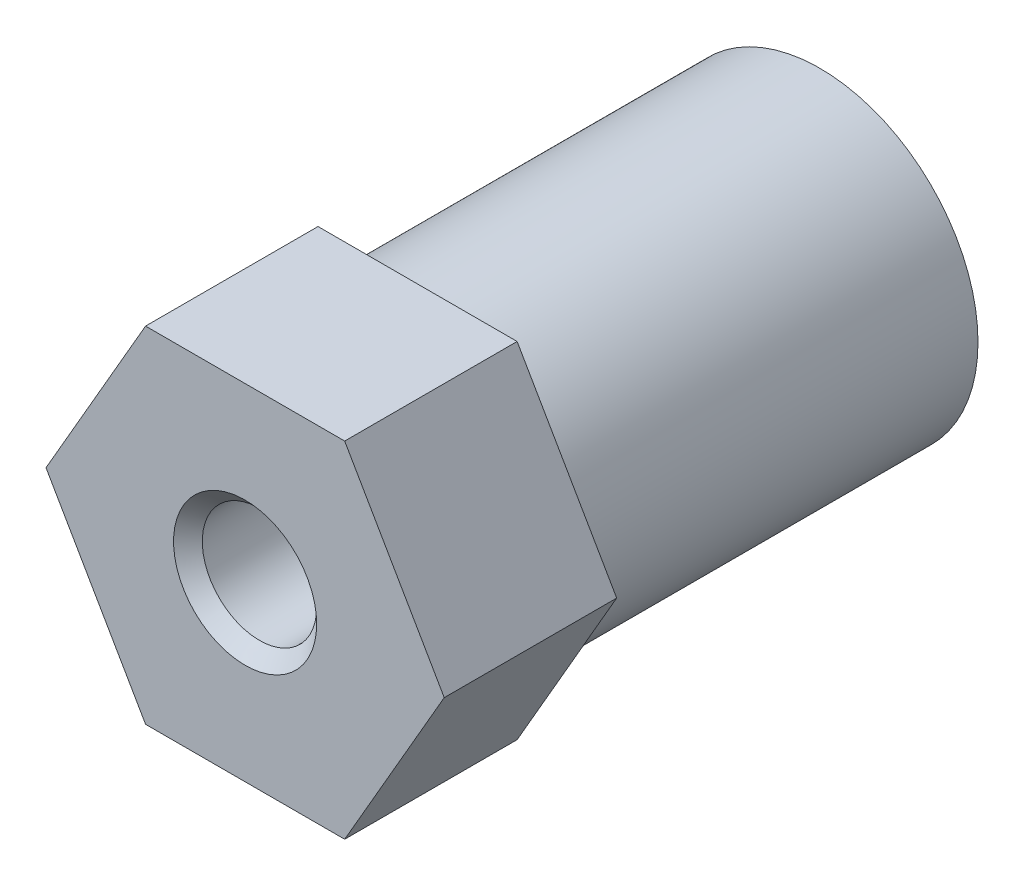
ISO-10303-21;
HEADER;
FILE_DESCRIPTION(('STEP AP214'),'2;1');
FILE_NAME('part.step','',(''),(''),'','','');
FILE_SCHEMA(('AUTOMOTIVE_DESIGN { 1 0 10303 214 1 1 1 1 }'));
ENDSEC;
DATA;
#1=APPLICATION_CONTEXT('core data for automotive mechanical design processes');
#2=APPLICATION_PROTOCOL_DEFINITION('international standard','automotive_design',2000,#1);
#3=PRODUCT_CONTEXT('',#1,'mechanical');
#4=PRODUCT('Part','Part','',(#3));
#5=PRODUCT_RELATED_PRODUCT_CATEGORY('part','',(#4));
#6=PRODUCT_DEFINITION_FORMATION('','',#4);
#7=PRODUCT_DEFINITION_CONTEXT('part definition',#1,'design');
#8=PRODUCT_DEFINITION('design','',#6,#7);
#9=PRODUCT_DEFINITION_SHAPE('','',#8);
#10=(LENGTH_UNIT() NAMED_UNIT(*) SI_UNIT(.MILLI.,.METRE.));
#11=(NAMED_UNIT(*) PLANE_ANGLE_UNIT() SI_UNIT($,.RADIAN.));
#12=(NAMED_UNIT(*) SI_UNIT($,.STERADIAN.) SOLID_ANGLE_UNIT());
#13=UNCERTAINTY_MEASURE_WITH_UNIT(LENGTH_MEASURE(1.E-05),#10,'distance_accuracy_value','');
#14=(GEOMETRIC_REPRESENTATION_CONTEXT(3) GLOBAL_UNCERTAINTY_ASSIGNED_CONTEXT((#13)) GLOBAL_UNIT_ASSIGNED_CONTEXT((#10,
#11,#12)) REPRESENTATION_CONTEXT('',''));
#15=CARTESIAN_POINT('',(0.,0.,0.));
#16=DIRECTION('',(0.,0.,1.));
#17=DIRECTION('',(1.,0.,0.));
#18=AXIS2_PLACEMENT_3D('',#15,#16,#17);
#19=CARTESIAN_POINT('',(2.23606797749979,2.,12.));
#20=DIRECTION('',(0.,1.,0.));
#21=DIRECTION('',(0.,0.,1.));
#22=AXIS2_PLACEMENT_3D('',#19,#20,#21);
#23=PLANE('',#22);
#24=DIRECTION('',(0.,0.,-1.));
#25=VECTOR('',#24,1.);
#26=CARTESIAN_POINT('',(-2.23606797749979,2.,12.));
#27=LINE('',#26,#25);
#28=CARTESIAN_POINT('',(-2.23606797749979,2.,12.));
#29=VERTEX_POINT('',#28);
#30=CARTESIAN_POINT('',(-2.23606797749979,2.,2.));
#31=VERTEX_POINT('',#30);
#32=EDGE_CURVE('E178',#29,#31,#27,.T.);
#33=ORIENTED_EDGE('',*,*,#32,.T.);
#34=DIRECTION('',(-1.,0.,0.));
#35=VECTOR('',#34,1.);
#36=CARTESIAN_POINT('',(2.23606797749979,2.,2.));
#37=LINE('',#36,#35);
#38=CARTESIAN_POINT('',(2.23606797749979,2.,2.));
#39=VERTEX_POINT('',#38);
#40=EDGE_CURVE('E260',#31,#39,#37,.F.);
#41=ORIENTED_EDGE('',*,*,#40,.T.);
#42=DIRECTION('',(0.,0.,-1.));
#43=VECTOR('',#42,1.);
#44=CARTESIAN_POINT('',(2.23606797749979,2.,12.));
#45=LINE('',#44,#43);
#46=CARTESIAN_POINT('',(2.23606797749979,2.,12.));
#47=VERTEX_POINT('',#46);
#48=EDGE_CURVE('E174',#47,#39,#45,.T.);
#49=ORIENTED_EDGE('',*,*,#48,.F.);
#50=DIRECTION('',(1.,0.,0.));
#51=VECTOR('',#50,1.);
#52=CARTESIAN_POINT('',(2.23606797749979,2.,12.));
#53=LINE('',#52,#51);
#54=EDGE_CURVE('E143',#29,#47,#53,.T.);
#55=ORIENTED_EDGE('',*,*,#54,.F.);
#56=EDGE_LOOP('',(#33,#41,#49,#55));
#57=FACE_BOUND('',#56,.T.);
#58=ADVANCED_FACE('F45',(#57),#23,.F.);
#59=CARTESIAN_POINT('',(2.23606797749979,-2.,12.));
#60=DIRECTION('',(0.,-1.,0.));
#61=DIRECTION('',(0.,0.,-1.));
#62=AXIS2_PLACEMENT_3D('',#59,#60,#61);
#63=PLANE('',#62);
#64=DIRECTION('',(0.,0.,-1.));
#65=VECTOR('',#64,1.);
#66=CARTESIAN_POINT('',(2.23606797749979,-2.,12.));
#67=LINE('',#66,#65);
#68=CARTESIAN_POINT('',(2.23606797749979,-2.,12.));
#69=VERTEX_POINT('',#68);
#70=CARTESIAN_POINT('',(2.23606797749979,-2.,2.));
#71=VERTEX_POINT('',#70);
#72=EDGE_CURVE('E134',#69,#71,#67,.T.);
#73=ORIENTED_EDGE('',*,*,#72,.T.);
#74=DIRECTION('',(1.,0.,0.));
#75=VECTOR('',#74,1.);
#76=CARTESIAN_POINT('',(-2.23606797749979,-2.,2.));
#77=LINE('',#76,#75);
#78=CARTESIAN_POINT('',(-2.23606797749979,-2.,2.));
#79=VERTEX_POINT('',#78);
#80=EDGE_CURVE('E69',#71,#79,#77,.F.);
#81=ORIENTED_EDGE('',*,*,#80,.T.);
#82=DIRECTION('',(0.,0.,-1.));
#83=VECTOR('',#82,1.);
#84=CARTESIAN_POINT('',(-2.23606797749979,-2.,12.));
#85=LINE('',#84,#83);
#86=CARTESIAN_POINT('',(-2.23606797749979,-2.,12.));
#87=VERTEX_POINT('',#86);
#88=EDGE_CURVE('E142',#87,#79,#85,.T.);
#89=ORIENTED_EDGE('',*,*,#88,.F.);
#90=DIRECTION('',(-1.,0.,0.));
#91=VECTOR('',#90,1.);
#92=CARTESIAN_POINT('',(2.23606797749979,-2.,12.));
#93=LINE('',#92,#91);
#94=EDGE_CURVE('E146',#69,#87,#93,.T.);
#95=ORIENTED_EDGE('',*,*,#94,.F.);
#96=EDGE_LOOP('',(#73,#81,#89,#95));
#97=FACE_BOUND('',#96,.T.);
#98=ADVANCED_FACE('F147',(#97),#63,.F.);
#99=CARTESIAN_POINT('',(0.,0.,14.));
#100=DIRECTION('',(0.,0.,-1.));
#101=DIRECTION('',(-1.,0.,0.));
#102=AXIS2_PLACEMENT_3D('',#99,#100,#101);
#103=CYLINDRICAL_SURFACE('',#102,5.5);
#104=CARTESIAN_POINT('',(0.,0.,14.));
#105=DIRECTION('',(0.,0.,1.));
#106=DIRECTION('',(1.,0.,0.));
#107=AXIS2_PLACEMENT_3D('',#104,#105,#106);
#108=CIRCLE('',#107,5.5);
#109=CARTESIAN_POINT('',(5.5,0.,14.));
#110=VERTEX_POINT('',#109);
#111=EDGE_CURVE('E249',#110,#110,#108,.T.);
#112=ORIENTED_EDGE('',*,*,#111,.F.);
#113=EDGE_LOOP('',(#112));
#114=FACE_BOUND('',#113,.T.);
#115=CARTESIAN_POINT('',(0.,0.,0.));
#116=DIRECTION('',(0.,0.,1.));
#117=DIRECTION('',(1.,0.,0.));
#118=AXIS2_PLACEMENT_3D('',#115,#116,#117);
#119=CIRCLE('',#118,5.5);
#120=CARTESIAN_POINT('',(5.5,0.,0.));
#121=VERTEX_POINT('',#120);
#122=EDGE_CURVE('E248',#121,#121,#119,.T.);
#123=ORIENTED_EDGE('',*,*,#122,.T.);
#124=EDGE_LOOP('',(#123));
#125=FACE_BOUND('',#124,.T.);
#126=ADVANCED_FACE('F293',(#114,#125),#103,.T.);
#127=CARTESIAN_POINT('',(0.,0.,0.));
#128=DIRECTION('',(0.,0.,1.));
#129=DIRECTION('',(1.,0.,0.));
#130=AXIS2_PLACEMENT_3D('',#127,#128,#129);
#131=PLANE('',#130);
#132=CARTESIAN_POINT('',(0.,0.,0.));
#133=DIRECTION('',(0.,0.,-1.));
#134=DIRECTION('',(-1.,0.,0.));
#135=AXIS2_PLACEMENT_3D('',#132,#133,#134);
#136=CIRCLE('',#135,3.);
#137=CARTESIAN_POINT('',(-3.,0.,0.));
#138=VERTEX_POINT('',#137);
#139=EDGE_CURVE('E158',#138,#138,#136,.T.);
#140=ORIENTED_EDGE('',*,*,#139,.F.);
#141=EDGE_LOOP('',(#140));
#142=FACE_BOUND('',#141,.T.);
#143=ORIENTED_EDGE('',*,*,#122,.F.);
#144=EDGE_LOOP('',(#143));
#145=FACE_BOUND('',#144,.T.);
#146=ADVANCED_FACE('F400',(#142,#145),#131,.F.);
#147=CARTESIAN_POINT('',(-3.46410161513776,6.,20.));
#148=DIRECTION('',(0.866025403784439,-0.5,0.));
#149=DIRECTION('',(0.5,0.866025403784439,0.));
#150=AXIS2_PLACEMENT_3D('',#147,#148,#149);
#151=PLANE('',#150);
#152=DIRECTION('',(-0.5,-0.866025403784438,0.));
#153=VECTOR('',#152,1.);
#154=CARTESIAN_POINT('',(-3.46410161513776,6.,14.));
#155=LINE('',#154,#153);
#156=CARTESIAN_POINT('',(-3.46410161513776,6.,14.));
#157=VERTEX_POINT('',#156);
#158=CARTESIAN_POINT('',(-6.92820323027551,0.,14.));
#159=VERTEX_POINT('',#158);
#160=EDGE_CURVE('E187',#157,#159,#155,.T.);
#161=ORIENTED_EDGE('',*,*,#160,.T.);
#162=DIRECTION('',(0.,0.,-1.));
#163=VECTOR('',#162,1.);
#164=CARTESIAN_POINT('',(-6.92820323027551,0.,20.));
#165=LINE('',#164,#163);
#166=CARTESIAN_POINT('',(-6.92820323027551,0.,20.));
#167=VERTEX_POINT('',#166);
#168=EDGE_CURVE('E244',#167,#159,#165,.T.);
#169=ORIENTED_EDGE('',*,*,#168,.F.);
#170=DIRECTION('',(-0.5,-0.866025403784438,0.));
#171=VECTOR('',#170,1.);
#172=CARTESIAN_POINT('',(-3.46410161513776,6.,20.));
#173=LINE('',#172,#171);
#174=CARTESIAN_POINT('',(-3.46410161513776,6.,20.));
#175=VERTEX_POINT('',#174);
#176=EDGE_CURVE('E188',#175,#167,#173,.T.);
#177=ORIENTED_EDGE('',*,*,#176,.F.);
#178=DIRECTION('',(0.,0.,-1.));
#179=VECTOR('',#178,1.);
#180=CARTESIAN_POINT('',(-3.46410161513776,6.,20.));
#181=LINE('',#180,#179);
#182=EDGE_CURVE('E207',#175,#157,#181,.T.);
#183=ORIENTED_EDGE('',*,*,#182,.T.);
#184=EDGE_LOOP('',(#161,#169,#177,#183));
#185=FACE_BOUND('',#184,.T.);
#186=ADVANCED_FACE('F403',(#185),#151,.F.);
#187=CARTESIAN_POINT('',(-6.92820323027551,0.,20.));
#188=DIRECTION('',(0.866025403784439,0.5,0.));
#189=DIRECTION('',(-0.5,0.866025403784439,0.));
#190=AXIS2_PLACEMENT_3D('',#187,#188,#189);
#191=PLANE('',#190);
#192=DIRECTION('',(0.5,-0.866025403784439,0.));
#193=VECTOR('',#192,1.);
#194=CARTESIAN_POINT('',(-6.92820323027551,0.,14.));
#195=LINE('',#194,#193);
#196=CARTESIAN_POINT('',(-3.46410161513776,-6.,14.));
#197=VERTEX_POINT('',#196);
#198=EDGE_CURVE('E211',#159,#197,#195,.T.);
#199=ORIENTED_EDGE('',*,*,#198,.T.);
#200=DIRECTION('',(0.,0.,-1.));
#201=VECTOR('',#200,1.);
#202=CARTESIAN_POINT('',(-3.46410161513776,-6.,20.));
#203=LINE('',#202,#201);
#204=CARTESIAN_POINT('',(-3.46410161513776,-6.,20.));
#205=VERTEX_POINT('',#204);
#206=EDGE_CURVE('E240',#205,#197,#203,.T.);
#207=ORIENTED_EDGE('',*,*,#206,.F.);
#208=DIRECTION('',(0.5,-0.866025403784439,0.));
#209=VECTOR('',#208,1.);
#210=CARTESIAN_POINT('',(-6.92820323027551,0.,20.));
#211=LINE('',#210,#209);
#212=EDGE_CURVE('E192',#167,#205,#211,.T.);
#213=ORIENTED_EDGE('',*,*,#212,.F.);
#214=ORIENTED_EDGE('',*,*,#168,.T.);
#215=EDGE_LOOP('',(#199,#207,#213,#214));
#216=FACE_BOUND('',#215,.T.);
#217=ADVANCED_FACE('F443',(#216),#191,.F.);
#218=CARTESIAN_POINT('',(-3.46410161513776,-6.,20.));
#219=DIRECTION('',(0.,1.,0.));
#220=DIRECTION('',(-1.,0.,0.));
#221=AXIS2_PLACEMENT_3D('',#218,#219,#220);
#222=PLANE('',#221);
#223=DIRECTION('',(1.,0.,0.));
#224=VECTOR('',#223,1.);
#225=CARTESIAN_POINT('',(-3.46410161513776,-6.,14.));
#226=LINE('',#225,#224);
#227=CARTESIAN_POINT('',(3.46410161513775,-6.,14.));
#228=VERTEX_POINT('',#227);
#229=EDGE_CURVE('E214',#197,#228,#226,.T.);
#230=ORIENTED_EDGE('',*,*,#229,.T.);
#231=DIRECTION('',(0.,0.,-1.));
#232=VECTOR('',#231,1.);
#233=CARTESIAN_POINT('',(3.46410161513775,-6.,20.));
#234=LINE('',#233,#232);
#235=CARTESIAN_POINT('',(3.46410161513775,-6.,20.));
#236=VERTEX_POINT('',#235);
#237=EDGE_CURVE('E236',#236,#228,#234,.T.);
#238=ORIENTED_EDGE('',*,*,#237,.F.);
#239=DIRECTION('',(1.,0.,0.));
#240=VECTOR('',#239,1.);
#241=CARTESIAN_POINT('',(-3.46410161513776,-6.,20.));
#242=LINE('',#241,#240);
#243=EDGE_CURVE('E195',#205,#236,#242,.T.);
#244=ORIENTED_EDGE('',*,*,#243,.F.);
#245=ORIENTED_EDGE('',*,*,#206,.T.);
#246=EDGE_LOOP('',(#230,#238,#244,#245));
#247=FACE_BOUND('',#246,.T.);
#248=ADVANCED_FACE('F440',(#247),#222,.F.);
#249=CARTESIAN_POINT('',(3.46410161513775,-6.,20.));
#250=DIRECTION('',(-0.866025403784439,0.5,0.));
#251=DIRECTION('',(-0.5,-0.866025403784439,0.));
#252=AXIS2_PLACEMENT_3D('',#249,#250,#251);
#253=PLANE('',#252);
#254=DIRECTION('',(0.5,0.866025403784439,0.));
#255=VECTOR('',#254,1.);
#256=CARTESIAN_POINT('',(3.46410161513775,-6.,14.));
#257=LINE('',#256,#255);
#258=CARTESIAN_POINT('',(6.92820323027551,0.,14.));
#259=VERTEX_POINT('',#258);
#260=EDGE_CURVE('E217',#228,#259,#257,.T.);
#261=ORIENTED_EDGE('',*,*,#260,.T.);
#262=DIRECTION('',(0.,0.,-1.));
#263=VECTOR('',#262,1.);
#264=CARTESIAN_POINT('',(6.92820323027551,0.,20.));
#265=LINE('',#264,#263);
#266=CARTESIAN_POINT('',(6.92820323027551,0.,20.));
#267=VERTEX_POINT('',#266);
#268=EDGE_CURVE('E232',#267,#259,#265,.T.);
#269=ORIENTED_EDGE('',*,*,#268,.F.);
#270=DIRECTION('',(0.5,0.866025403784439,0.));
#271=VECTOR('',#270,1.);
#272=CARTESIAN_POINT('',(3.46410161513775,-6.,20.));
#273=LINE('',#272,#271);
#274=EDGE_CURVE('E198',#236,#267,#273,.T.);
#275=ORIENTED_EDGE('',*,*,#274,.F.);
#276=ORIENTED_EDGE('',*,*,#237,.T.);
#277=EDGE_LOOP('',(#261,#269,#275,#276));
#278=FACE_BOUND('',#277,.T.);
#279=ADVANCED_FACE('F435',(#278),#253,.F.);
#280=CARTESIAN_POINT('',(6.92820323027551,0.,20.));
#281=DIRECTION('',(-0.866025403784439,-0.5,0.));
#282=DIRECTION('',(0.5,-0.866025403784439,0.));
#283=AXIS2_PLACEMENT_3D('',#280,#281,#282);
#284=PLANE('',#283);
#285=DIRECTION('',(-0.5,0.866025403784439,0.));
#286=VECTOR('',#285,1.);
#287=CARTESIAN_POINT('',(6.92820323027551,0.,14.));
#288=LINE('',#287,#286);
#289=CARTESIAN_POINT('',(3.46410161513776,6.,14.));
#290=VERTEX_POINT('',#289);
#291=EDGE_CURVE('E220',#259,#290,#288,.T.);
#292=ORIENTED_EDGE('',*,*,#291,.T.);
#293=DIRECTION('',(0.,0.,-1.));
#294=VECTOR('',#293,1.);
#295=CARTESIAN_POINT('',(3.46410161513776,6.,20.));
#296=LINE('',#295,#294);
#297=CARTESIAN_POINT('',(3.46410161513776,6.,20.));
#298=VERTEX_POINT('',#297);
#299=EDGE_CURVE('E228',#298,#290,#296,.T.);
#300=ORIENTED_EDGE('',*,*,#299,.F.);
#301=DIRECTION('',(-0.5,0.866025403784439,0.));
#302=VECTOR('',#301,1.);
#303=CARTESIAN_POINT('',(6.92820323027551,0.,20.));
#304=LINE('',#303,#302);
#305=EDGE_CURVE('E201',#267,#298,#304,.T.);
#306=ORIENTED_EDGE('',*,*,#305,.F.);
#307=ORIENTED_EDGE('',*,*,#268,.T.);
#308=EDGE_LOOP('',(#292,#300,#306,#307));
#309=FACE_BOUND('',#308,.T.);
#310=ADVANCED_FACE('F431',(#309),#284,.F.);
#311=CARTESIAN_POINT('',(3.46410161513776,6.,20.));
#312=DIRECTION('',(0.,-1.,0.));
#313=DIRECTION('',(0.,0.,-1.));
#314=AXIS2_PLACEMENT_3D('',#311,#312,#313);
#315=PLANE('',#314);
#316=DIRECTION('',(-1.,0.,0.));
#317=VECTOR('',#316,1.);
#318=CARTESIAN_POINT('',(3.46410161513776,6.,14.));
#319=LINE('',#318,#317);
#320=EDGE_CURVE('E193',#290,#157,#319,.T.);
#321=ORIENTED_EDGE('',*,*,#320,.T.);
#322=ORIENTED_EDGE('',*,*,#182,.F.);
#323=DIRECTION('',(-1.,0.,0.));
#324=VECTOR('',#323,1.);
#325=CARTESIAN_POINT('',(3.46410161513776,6.,20.));
#326=LINE('',#325,#324);
#327=EDGE_CURVE('E204',#298,#175,#326,.T.);
#328=ORIENTED_EDGE('',*,*,#327,.F.);
#329=ORIENTED_EDGE('',*,*,#299,.T.);
#330=EDGE_LOOP('',(#321,#322,#328,#329));
#331=FACE_BOUND('',#330,.T.);
#332=ADVANCED_FACE('F427',(#331),#315,.F.);
#333=CARTESIAN_POINT('',(0.,0.,20.));
#334=DIRECTION('',(0.,0.,1.));
#335=DIRECTION('',(1.,0.,0.));
#336=AXIS2_PLACEMENT_3D('',#333,#334,#335);
#337=PLANE('',#336);
#338=CARTESIAN_POINT('',(0.,0.,20.));
#339=DIRECTION('',(0.,0.,1.));
#340=DIRECTION('',(1.,0.,0.));
#341=AXIS2_PLACEMENT_3D('',#338,#339,#340);
#342=CIRCLE('',#341,2.49000000000001);
#343=CARTESIAN_POINT('',(2.49000000000001,0.,20.));
#344=VERTEX_POINT('',#343);
#345=EDGE_CURVE('E11',#344,#344,#342,.F.);
#346=ORIENTED_EDGE('',*,*,#345,.T.);
#347=EDGE_LOOP('',(#346));
#348=FACE_BOUND('',#347,.T.);
#349=ORIENTED_EDGE('',*,*,#176,.T.);
#350=ORIENTED_EDGE('',*,*,#212,.T.);
#351=ORIENTED_EDGE('',*,*,#243,.T.);
#352=ORIENTED_EDGE('',*,*,#274,.T.);
#353=ORIENTED_EDGE('',*,*,#305,.T.);
#354=ORIENTED_EDGE('',*,*,#327,.T.);
#355=EDGE_LOOP('',(#349,#350,#351,#352,#353,#354));
#356=FACE_BOUND('',#355,.T.);
#357=ADVANCED_FACE('F415',(#348,#356),#337,.T.);
#358=CARTESIAN_POINT('',(0.,0.,14.));
#359=DIRECTION('',(0.,0.,1.));
#360=DIRECTION('',(1.,0.,0.));
#361=AXIS2_PLACEMENT_3D('',#358,#359,#360);
#362=PLANE('',#361);
#363=ORIENTED_EDGE('',*,*,#111,.T.);
#364=EDGE_LOOP('',(#363));
#365=FACE_BOUND('',#364,.T.);
#366=ORIENTED_EDGE('',*,*,#160,.F.);
#367=ORIENTED_EDGE('',*,*,#320,.F.);
#368=ORIENTED_EDGE('',*,*,#291,.F.);
#369=ORIENTED_EDGE('',*,*,#260,.F.);
#370=ORIENTED_EDGE('',*,*,#229,.F.);
#371=ORIENTED_EDGE('',*,*,#198,.F.);
#372=EDGE_LOOP('',(#366,#367,#368,#369,#370,#371));
#373=FACE_BOUND('',#372,.T.);
#374=ADVANCED_FACE('F412',(#365,#373),#362,.F.);
#375=CARTESIAN_POINT('',(0.,0.,12.));
#376=DIRECTION('',(0.,0.,1.));
#377=DIRECTION('',(1.,0.,0.));
#378=AXIS2_PLACEMENT_3D('',#375,#376,#377);
#379=CYLINDRICAL_SURFACE('',#378,1.99);
#380=CARTESIAN_POINT('',(0.,0.,19.5));
#381=DIRECTION('',(0.,0.,1.));
#382=DIRECTION('',(1.,0.,0.));
#383=AXIS2_PLACEMENT_3D('',#380,#381,#382);
#384=CIRCLE('',#383,1.99);
#385=CARTESIAN_POINT('',(1.99,0.,19.5));
#386=VERTEX_POINT('',#385);
#387=EDGE_CURVE('E55',#386,#386,#384,.T.);
#388=ORIENTED_EDGE('',*,*,#387,.T.);
#389=EDGE_LOOP('',(#388));
#390=FACE_BOUND('',#389,.T.);
#391=CARTESIAN_POINT('',(0.,0.,12.));
#392=DIRECTION('',(0.,0.,1.));
#393=DIRECTION('',(1.,0.,0.));
#394=AXIS2_PLACEMENT_3D('',#391,#392,#393);
#395=CIRCLE('',#394,1.99);
#396=CARTESIAN_POINT('',(1.99,0.,12.));
#397=VERTEX_POINT('',#396);
#398=EDGE_CURVE('E177',#397,#397,#395,.T.);
#399=ORIENTED_EDGE('',*,*,#398,.F.);
#400=EDGE_LOOP('',(#399));
#401=FACE_BOUND('',#400,.T.);
#402=ADVANCED_FACE('F316',(#390,#401),#379,.F.);
#403=CARTESIAN_POINT('',(0.,0.,12.));
#404=DIRECTION('',(0.,0.,-1.));
#405=DIRECTION('',(-1.,0.,0.));
#406=AXIS2_PLACEMENT_3D('',#403,#404,#405);
#407=PLANE('',#406);
#408=CARTESIAN_POINT('',(0.,0.,12.));
#409=DIRECTION('',(0.,0.,-1.));
#410=DIRECTION('',(-1.,0.,0.));
#411=AXIS2_PLACEMENT_3D('',#408,#409,#410);
#412=CIRCLE('',#411,3.);
#413=EDGE_CURVE('E139',#47,#69,#412,.T.);
#414=ORIENTED_EDGE('',*,*,#413,.T.);
#415=ORIENTED_EDGE('',*,*,#94,.T.);
#416=CARTESIAN_POINT('',(0.,0.,12.));
#417=DIRECTION('',(0.,0.,-1.));
#418=DIRECTION('',(-1.,0.,0.));
#419=AXIS2_PLACEMENT_3D('',#416,#417,#418);
#420=CIRCLE('',#419,3.);
#421=EDGE_CURVE('E152',#87,#29,#420,.T.);
#422=ORIENTED_EDGE('',*,*,#421,.T.);
#423=ORIENTED_EDGE('',*,*,#54,.T.);
#424=EDGE_LOOP('',(#414,#415,#422,#423));
#425=FACE_BOUND('',#424,.T.);
#426=ORIENTED_EDGE('',*,*,#398,.T.);
#427=EDGE_LOOP('',(#426));
#428=FACE_BOUND('',#427,.T.);
#429=ADVANCED_FACE('F154',(#425,#428),#407,.T.);
#430=CARTESIAN_POINT('',(0.,0.,12.));
#431=DIRECTION('',(0.,0.,-1.));
#432=DIRECTION('',(-1.,0.,0.));
#433=AXIS2_PLACEMENT_3D('',#430,#431,#432);
#434=CYLINDRICAL_SURFACE('',#433,3.);
#435=ORIENTED_EDGE('',*,*,#139,.T.);
#436=EDGE_LOOP('',(#435));
#437=FACE_BOUND('',#436,.T.);
#438=CARTESIAN_POINT('',(0.,0.,1.5));
#439=DIRECTION('',(0.,0.,-1.));
#440=DIRECTION('',(-1.,0.,0.));
#441=AXIS2_PLACEMENT_3D('',#438,#439,#440);
#442=CIRCLE('',#441,3.);
#443=CARTESIAN_POINT('',(1.6583123951777,-2.5,1.5));
#444=VERTEX_POINT('',#443);
#445=CARTESIAN_POINT('',(-1.6583123951777,-2.5,1.5));
#446=VERTEX_POINT('',#445);
#447=EDGE_CURVE('E168',#444,#446,#442,.T.);
#448=ORIENTED_EDGE('',*,*,#447,.F.);
#449=CARTESIAN_POINT('',(1.6583123951777,-2.5,1.5));
#450=CARTESIAN_POINT('',(1.686685574335,-2.48118634349568,1.50001114225031));
#451=CARTESIAN_POINT('',(1.71475813919343,-2.46186288459904,1.50106399634946));
#452=CARTESIAN_POINT('',(1.77023433936187,-2.42227750666596,1.50567038120268));
#453=CARTESIAN_POINT('',(1.79763382207024,-2.40201129563713,1.50923666640761));
#454=CARTESIAN_POINT('',(1.85182298451462,-2.36049490812776,1.51937423619315));
#455=CARTESIAN_POINT('',(1.87859638498599,-2.33923429026674,1.52599172502152));
#456=CARTESIAN_POINT('',(1.93069378652664,-2.2964219098173,1.54274375912904));
#457=CARTESIAN_POINT('',(1.95602106713984,-2.27487095513514,1.55286994562929));
#458=CARTESIAN_POINT('',(2.00352854772826,-2.23311861033452,1.57653972837565));
#459=CARTESIAN_POINT('',(2.02580484491539,-2.21290720822436,1.58986915550978));
#460=CARTESIAN_POINT('',(2.06812583467583,-2.17340464034994,1.62058231984035));
#461=CARTESIAN_POINT('',(2.08817971718188,-2.15410988911167,1.6379483649406));
#462=CARTESIAN_POINT('',(2.12266633931463,-2.12009066789494,1.67413334326885));
#463=CARTESIAN_POINT('',(2.13749072844714,-2.10511571802555,1.69233856864437));
#464=CARTESIAN_POINT('',(2.16461187452528,-2.07721774487165,1.73196929500812));
#465=CARTESIAN_POINT('',(2.17690968080016,-2.06429387025311,1.75339345269704));
#466=CARTESIAN_POINT('',(2.19651150127353,-2.04340551098062,1.7951425423394));
#467=CARTESIAN_POINT('',(2.20431358759365,-2.03496844110853,1.81499631608498));
#468=CARTESIAN_POINT('',(2.21750266020016,-2.02058837265816,1.85632896163363));
#469=CARTESIAN_POINT('',(2.22289367051298,-2.01464121953807,1.87780505525366));
#470=CARTESIAN_POINT('',(2.22996266063237,-2.00681030083135,1.91609520614005));
#471=CARTESIAN_POINT('',(2.23224180835755,-2.00427185549075,1.93266808755406));
#472=CARTESIAN_POINT('',(2.23529908912286,-2.00085964205873,1.96615545512857));
#473=CARTESIAN_POINT('',(2.23607401870716,-1.99998942675956,1.98307059299181));
#474=CARTESIAN_POINT('',(2.23606797749979,-2.,2.));
#475=B_SPLINE_CURVE_WITH_KNOTS('',3,(#449,#450,#451,#452,#453,#454,#455,#456,#457,#458,#459,
#460,#461,#462,#463,#464,#465,#466,#467,#468,#469,#470,#471,#472,#473,#474),.UNSPECIFIED.,.F.,
.F.,(4,2,2,2,2,2,2,2,2,2,2,2,4),(0.,0.102158391319055,0.204838955018789,0.309128225213242,
0.41317073585731,0.511592620984886,0.609591006305015,0.692815668784243,0.77600569657881,
0.844541537354591,0.912962562707333,0.963578132947559,1.01430137880361),.UNSPECIFIED.);
#476=EDGE_CURVE('E62',#444,#71,#475,.T.);
#477=ORIENTED_EDGE('',*,*,#476,.T.);
#478=ORIENTED_EDGE('',*,*,#72,.F.);
#479=ORIENTED_EDGE('',*,*,#413,.F.);
#480=ORIENTED_EDGE('',*,*,#48,.T.);
#481=CARTESIAN_POINT('',(2.23606797749979,2.,2.));
#482=CARTESIAN_POINT('',(2.23609051463813,1.99996314456617,1.97728819850553));
#483=CARTESIAN_POINT('',(2.23468615647214,2.00154505931008,1.95461357147146));
#484=CARTESIAN_POINT('',(2.22921431389916,2.00764344179947,1.91013583118931));
#485=CARTESIAN_POINT('',(2.22516389345562,2.01214110501253,1.88832807715498));
#486=CARTESIAN_POINT('',(2.21459459832048,2.0237658003137,1.84610743758677));
#487=CARTESIAN_POINT('',(2.20807957493583,2.03088872959056,1.82569243412387));
#488=CARTESIAN_POINT('',(2.19285313096424,2.04732060076244,1.7866195943571));
#489=CARTESIAN_POINT('',(2.18413826158172,2.05663297355749,1.76796458094776));
#490=CARTESIAN_POINT('',(2.16186587002878,2.0800643693,1.72731088059639));
#491=CARTESIAN_POINT('',(2.14764179063573,2.09478359832793,1.70602349545034));
#492=CARTESIAN_POINT('',(2.11662069282733,2.12612453590936,1.66706672692429));
#493=CARTESIAN_POINT('',(2.09982110704814,2.14274813858969,1.64940099527646));
#494=CARTESIAN_POINT('',(2.05748672075047,2.18355210274191,1.61154120597602));
#495=CARTESIAN_POINT('',(2.0310435948951,2.2082222865356,1.59289692325049));
#496=CARTESIAN_POINT('',(1.97533366021774,2.25820149883692,1.56135106573089));
#497=CARTESIAN_POINT('',(1.94605366832733,2.28351306255232,1.54847803608779));
#498=CARTESIAN_POINT('',(1.87529157937846,2.34222908619343,1.52415166389725));
#499=CARTESIAN_POINT('',(1.83302355157839,2.37548519653979,1.51463991119056));
#500=CARTESIAN_POINT('',(1.76822721578429,2.42365276920452,1.50559876214872));
#501=CARTESIAN_POINT('',(1.7465466067642,2.43932264777204,1.50345343379505));
#502=CARTESIAN_POINT('',(1.70274884939221,2.47009288441735,1.50065778706483));
#503=CARTESIAN_POINT('',(1.6806325902633,2.48519424981864,1.50000468891339));
#504=CARTESIAN_POINT('',(1.6583123951777,2.5,1.5));
#505=B_SPLINE_CURVE_WITH_KNOTS('',3,(#481,#482,#483,#484,#485,#486,#487,#488,#489,#490,#491,
#492,#493,#494,#495,#496,#497,#498,#499,#500,#501,#502,#503,#504),.UNSPECIFIED.,.F.,.F.,(4,2,2,
2,2,2,2,2,2,2,2,4),(0.,0.0679782747901412,0.135522441124971,0.202961492796715,0.270506935513172,
0.358617883389312,0.446817241714022,0.568203450731397,0.690183596526598,0.853285284058403,
0.933759487843971,1.0140836590189),.UNSPECIFIED.);
#506=CARTESIAN_POINT('',(1.6583123951777,2.5,1.5));
#507=VERTEX_POINT('',#506);
#508=EDGE_CURVE('E277',#39,#507,#505,.T.);
#509=ORIENTED_EDGE('',*,*,#508,.T.);
#510=CARTESIAN_POINT('',(-1.6583123951777,2.5,1.5));
#511=VERTEX_POINT('',#510);
#512=EDGE_CURVE('E165',#511,#507,#442,.T.);
#513=ORIENTED_EDGE('',*,*,#512,.F.);
#514=CARTESIAN_POINT('',(-1.6583123951777,2.5,1.5));
#515=CARTESIAN_POINT('',(-1.686685574335,2.48118634349568,1.50001114225031));
#516=CARTESIAN_POINT('',(-1.71475813919343,2.46186288459904,1.50106399634946));
#517=CARTESIAN_POINT('',(-1.77023433936187,2.42227750666596,1.50567038120268));
#518=CARTESIAN_POINT('',(-1.79763382207024,2.40201129563713,1.50923666640761));
#519=CARTESIAN_POINT('',(-1.85182298451462,2.36049490812776,1.51937423619315));
#520=CARTESIAN_POINT('',(-1.87859638498599,2.33923429026674,1.52599172502152));
#521=CARTESIAN_POINT('',(-1.93069378652664,2.2964219098173,1.54274375912904));
#522=CARTESIAN_POINT('',(-1.95602106713984,2.27487095513514,1.55286994562929));
#523=CARTESIAN_POINT('',(-2.00352854772826,2.23311861033452,1.57653972837565));
#524=CARTESIAN_POINT('',(-2.02580484491539,2.21290720822436,1.58986915550978));
#525=CARTESIAN_POINT('',(-2.06812583467583,2.17340464034994,1.62058231984035));
#526=CARTESIAN_POINT('',(-2.08817971718188,2.15410988911167,1.6379483649406));
#527=CARTESIAN_POINT('',(-2.12266633931463,2.12009066789494,1.67413334326885));
#528=CARTESIAN_POINT('',(-2.13749072844714,2.10511571802555,1.69233856864437));
#529=CARTESIAN_POINT('',(-2.16461187452528,2.07721774487165,1.73196929500812));
#530=CARTESIAN_POINT('',(-2.17690968080016,2.06429387025311,1.75339345269704));
#531=CARTESIAN_POINT('',(-2.19651150127353,2.04340551098062,1.7951425423394));
#532=CARTESIAN_POINT('',(-2.20431358759365,2.03496844110853,1.81499631608498));
#533=CARTESIAN_POINT('',(-2.21750266020016,2.02058837265816,1.85632896163363));
#534=CARTESIAN_POINT('',(-2.22289367051298,2.01464121953807,1.87780505525366));
#535=CARTESIAN_POINT('',(-2.22996266063237,2.00681030083135,1.91609520614005));
#536=CARTESIAN_POINT('',(-2.23224180835755,2.00427185549075,1.93266808755406));
#537=CARTESIAN_POINT('',(-2.23529908912286,2.00085964205873,1.96615545512857));
#538=CARTESIAN_POINT('',(-2.23607401870716,1.99998942675956,1.98307059299181));
#539=CARTESIAN_POINT('',(-2.23606797749979,2.,2.));
#540=B_SPLINE_CURVE_WITH_KNOTS('',3,(#514,#515,#516,#517,#518,#519,#520,#521,#522,#523,#524,
#525,#526,#527,#528,#529,#530,#531,#532,#533,#534,#535,#536,#537,#538,#539),.UNSPECIFIED.,.F.,
.F.,(4,2,2,2,2,2,2,2,2,2,2,2,4),(0.,0.102158391319055,0.204838955018789,0.309128225213242,
0.41317073585731,0.511592620984886,0.609591006305015,0.692815668784243,0.77600569657881,
0.844541537354591,0.912962562707333,0.963578132947559,1.01430137880361),.UNSPECIFIED.);
#541=EDGE_CURVE('E268',#511,#31,#540,.T.);
#542=ORIENTED_EDGE('',*,*,#541,.T.);
#543=ORIENTED_EDGE('',*,*,#32,.F.);
#544=ORIENTED_EDGE('',*,*,#421,.F.);
#545=ORIENTED_EDGE('',*,*,#88,.T.);
#546=CARTESIAN_POINT('',(-2.23606797749979,-2.,2.));
#547=CARTESIAN_POINT('',(-2.23609051463813,-1.99996314456617,1.97728819850553));
#548=CARTESIAN_POINT('',(-2.23468615647214,-2.00154505931008,1.95461357147146));
#549=CARTESIAN_POINT('',(-2.22921431389916,-2.00764344179947,1.91013583118931));
#550=CARTESIAN_POINT('',(-2.22516389345562,-2.01214110501253,1.88832807715498));
#551=CARTESIAN_POINT('',(-2.21459459832048,-2.0237658003137,1.84610743758677));
#552=CARTESIAN_POINT('',(-2.20807957493583,-2.03088872959056,1.82569243412387));
#553=CARTESIAN_POINT('',(-2.19285313096424,-2.04732060076244,1.7866195943571));
#554=CARTESIAN_POINT('',(-2.18413826158172,-2.05663297355749,1.76796458094776));
#555=CARTESIAN_POINT('',(-2.16186587002878,-2.0800643693,1.72731088059639));
#556=CARTESIAN_POINT('',(-2.14764179063573,-2.09478359832793,1.70602349545034));
#557=CARTESIAN_POINT('',(-2.11662069282733,-2.12612453590936,1.66706672692429));
#558=CARTESIAN_POINT('',(-2.09982110704814,-2.14274813858969,1.64940099527646));
#559=CARTESIAN_POINT('',(-2.05748672075047,-2.18355210274191,1.61154120597602));
#560=CARTESIAN_POINT('',(-2.0310435948951,-2.2082222865356,1.59289692325049));
#561=CARTESIAN_POINT('',(-1.97533366021774,-2.25820149883692,1.56135106573089));
#562=CARTESIAN_POINT('',(-1.94605366832733,-2.28351306255232,1.54847803608779));
#563=CARTESIAN_POINT('',(-1.87529157937846,-2.34222908619343,1.52415166389725));
#564=CARTESIAN_POINT('',(-1.83302355157839,-2.37548519653979,1.51463991119056));
#565=CARTESIAN_POINT('',(-1.76822721578429,-2.42365276920452,1.50559876214872));
#566=CARTESIAN_POINT('',(-1.7465466067642,-2.43932264777204,1.50345343379505));
#567=CARTESIAN_POINT('',(-1.70274884939221,-2.47009288441735,1.50065778706483));
#568=CARTESIAN_POINT('',(-1.6806325902633,-2.48519424981864,1.50000468891339));
#569=CARTESIAN_POINT('',(-1.6583123951777,-2.5,1.5));
#570=B_SPLINE_CURVE_WITH_KNOTS('',3,(#546,#547,#548,#549,#550,#551,#552,#553,#554,#555,#556,
#557,#558,#559,#560,#561,#562,#563,#564,#565,#566,#567,#568,#569),.UNSPECIFIED.,.F.,.F.,(4,2,2,
2,2,2,2,2,2,2,2,4),(0.,0.0679782747901412,0.135522441124971,0.202961492796715,0.270506935513172,
0.358617883389312,0.446817241714022,0.568203450731397,0.690183596526598,0.853285284058403,
0.933759487843971,1.0140836590189),.UNSPECIFIED.);
#571=EDGE_CURVE('E305',#79,#446,#570,.T.);
#572=ORIENTED_EDGE('',*,*,#571,.T.);
#573=EDGE_LOOP('',(#448,#477,#478,#479,#480,#509,#513,#542,#543,#544,#545,#572));
#574=FACE_BOUND('',#573,.T.);
#575=ADVANCED_FACE('F136',(#437,#574),#434,.F.);
#576=CARTESIAN_POINT('',(0.,0.,1.5));
#577=DIRECTION('',(0.,0.,-1.));
#578=DIRECTION('',(-1.,0.,0.));
#579=AXIS2_PLACEMENT_3D('',#576,#577,#578);
#580=PLANE('',#579);
#581=ORIENTED_EDGE('',*,*,#447,.T.);
#582=DIRECTION('',(1.,0.,0.));
#583=VECTOR('',#582,1.);
#584=CARTESIAN_POINT('',(2.23606797749979,-2.5,1.5));
#585=LINE('',#584,#583);
#586=EDGE_CURVE('E262',#446,#444,#585,.T.);
#587=ORIENTED_EDGE('',*,*,#586,.T.);
#588=EDGE_LOOP('',(#581,#587));
#589=FACE_BOUND('',#588,.T.);
#590=ADVANCED_FACE('F334',(#589),#580,.T.);
#591=ORIENTED_EDGE('',*,*,#512,.T.);
#592=DIRECTION('',(-1.,0.,0.));
#593=VECTOR('',#592,1.);
#594=CARTESIAN_POINT('',(-2.23606797749979,2.5,1.5));
#595=LINE('',#594,#593);
#596=EDGE_CURVE('E253',#507,#511,#595,.T.);
#597=ORIENTED_EDGE('',*,*,#596,.T.);
#598=EDGE_LOOP('',(#591,#597));
#599=FACE_BOUND('',#598,.T.);
#600=ADVANCED_FACE('F291',(#599),#580,.T.);
#601=CARTESIAN_POINT('',(0.,2.5,2.));
#602=DIRECTION('',(1.,0.,0.));
#603=DIRECTION('',(0.,0.,-1.));
#604=AXIS2_PLACEMENT_3D('',#601,#602,#603);
#605=CYLINDRICAL_SURFACE('',#604,0.5);
#606=ORIENTED_EDGE('',*,*,#508,.F.);
#607=ORIENTED_EDGE('',*,*,#40,.F.);
#608=ORIENTED_EDGE('',*,*,#541,.F.);
#609=ORIENTED_EDGE('',*,*,#596,.F.);
#610=EDGE_LOOP('',(#606,#607,#608,#609));
#611=FACE_BOUND('',#610,.T.);
#612=ADVANCED_FACE('F286',(#611),#605,.T.);
#613=CARTESIAN_POINT('',(0.,-2.5,2.));
#614=DIRECTION('',(-1.,0.,0.));
#615=DIRECTION('',(0.,0.,1.));
#616=AXIS2_PLACEMENT_3D('',#613,#614,#615);
#617=CYLINDRICAL_SURFACE('',#616,0.5);
#618=ORIENTED_EDGE('',*,*,#571,.F.);
#619=ORIENTED_EDGE('',*,*,#80,.F.);
#620=ORIENTED_EDGE('',*,*,#476,.F.);
#621=ORIENTED_EDGE('',*,*,#586,.F.);
#622=EDGE_LOOP('',(#618,#619,#620,#621));
#623=FACE_BOUND('',#622,.T.);
#624=ADVANCED_FACE('F290',(#623),#617,.T.);
#625=CARTESIAN_POINT('',(0.,0.,19.5));
#626=DIRECTION('',(0.,0.,1.));
#627=DIRECTION('',(1.,0.,0.));
#628=AXIS2_PLACEMENT_3D('',#625,#626,#627);
#629=CONICAL_SURFACE('',#628,1.99,0.785398163397454);
#630=ORIENTED_EDGE('',*,*,#345,.F.);
#631=EDGE_LOOP('',(#630));
#632=FACE_BOUND('',#631,.T.);
#633=ORIENTED_EDGE('',*,*,#387,.F.);
#634=EDGE_LOOP('',(#633));
#635=FACE_BOUND('',#634,.T.);
#636=ADVANCED_FACE('F48',(#632,#635),#629,.F.);
#637=CLOSED_SHELL('',(#58,#98,#126,#146,#186,#217,#248,#279,#310,#332,#357,#374,#402,#429,#575,
#590,#600,#612,#624,#636));
#638=MANIFOLD_SOLID_BREP('B2',#637);
#639=ADVANCED_BREP_SHAPE_REPRESENTATION('',(#18,#638),#14);
#640=SHAPE_DEFINITION_REPRESENTATION(#9,#639);
ENDSEC;
END-ISO-10303-21;
